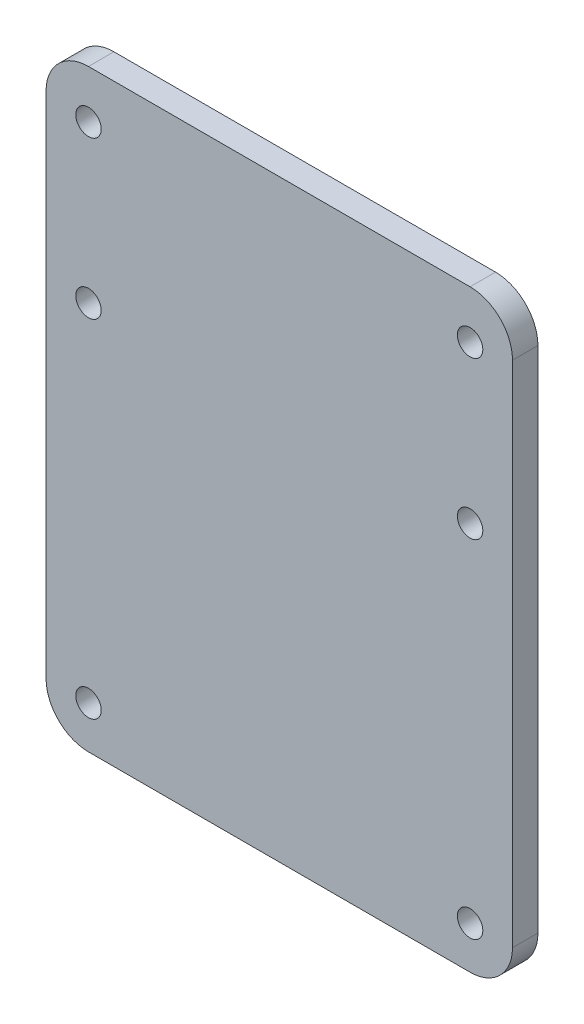
ISO-10303-21;
HEADER;
FILE_DESCRIPTION(('STEP AP214'),'2;1');
FILE_NAME('part.step','',(''),(''),'','','');
FILE_SCHEMA(('AUTOMOTIVE_DESIGN { 1 0 10303 214 1 1 1 1 }'));
ENDSEC;
DATA;
#1=APPLICATION_CONTEXT('core data for automotive mechanical design processes');
#2=APPLICATION_PROTOCOL_DEFINITION('international standard','automotive_design',2000,#1);
#3=PRODUCT_CONTEXT('',#1,'mechanical');
#4=PRODUCT('Part','Part','',(#3));
#5=PRODUCT_RELATED_PRODUCT_CATEGORY('part','',(#4));
#6=PRODUCT_DEFINITION_FORMATION('','',#4);
#7=PRODUCT_DEFINITION_CONTEXT('part definition',#1,'design');
#8=PRODUCT_DEFINITION('design','',#6,#7);
#9=PRODUCT_DEFINITION_SHAPE('','',#8);
#10=(LENGTH_UNIT() NAMED_UNIT(*) SI_UNIT(.MILLI.,.METRE.));
#11=(NAMED_UNIT(*) PLANE_ANGLE_UNIT() SI_UNIT($,.RADIAN.));
#12=(NAMED_UNIT(*) SI_UNIT($,.STERADIAN.) SOLID_ANGLE_UNIT());
#13=UNCERTAINTY_MEASURE_WITH_UNIT(LENGTH_MEASURE(1.E-05),#10,'distance_accuracy_value','');
#14=(GEOMETRIC_REPRESENTATION_CONTEXT(3) GLOBAL_UNCERTAINTY_ASSIGNED_CONTEXT((#13)) GLOBAL_UNIT_ASSIGNED_CONTEXT((#10,
#11,#12)) REPRESENTATION_CONTEXT('',''));
#15=CARTESIAN_POINT('',(0.,0.,0.));
#16=DIRECTION('',(0.,0.,1.));
#17=DIRECTION('',(1.,0.,0.));
#18=AXIS2_PLACEMENT_3D('',#15,#16,#17);
#19=CARTESIAN_POINT('',(-25.7371794871795,42.2489316239316,3.));
#20=DIRECTION('',(1.,0.,0.));
#21=DIRECTION('',(0.,1.,0.));
#22=AXIS2_PLACEMENT_3D('',#19,#20,#21);
#23=PLANE('',#22);
#24=DIRECTION('',(0.,-1.,0.));
#25=VECTOR('',#24,1.);
#26=CARTESIAN_POINT('',(-25.7371794871795,42.2489316239316,0.));
#27=LINE('',#26,#25);
#28=CARTESIAN_POINT('',(-25.7371794871795,37.2489316239316,0.));
#29=VERTEX_POINT('',#28);
#30=CARTESIAN_POINT('',(-25.7371794871795,-22.7510683760684,0.));
#31=VERTEX_POINT('',#30);
#32=EDGE_CURVE('E146',#29,#31,#27,.T.);
#33=ORIENTED_EDGE('',*,*,#32,.T.);
#34=DIRECTION('',(0.,0.,-1.));
#35=VECTOR('',#34,1.);
#36=CARTESIAN_POINT('',(-25.7371794871795,-22.7510683760684,3.));
#37=LINE('',#36,#35);
#38=CARTESIAN_POINT('',(-25.7371794871795,-22.7510683760684,3.));
#39=VERTEX_POINT('',#38);
#40=EDGE_CURVE('E180',#31,#39,#37,.F.);
#41=ORIENTED_EDGE('',*,*,#40,.T.);
#42=DIRECTION('',(0.,-1.,0.));
#43=VECTOR('',#42,1.);
#44=CARTESIAN_POINT('',(-25.7371794871795,42.2489316239316,3.));
#45=LINE('',#44,#43);
#46=CARTESIAN_POINT('',(-25.7371794871795,37.2489316239316,3.));
#47=VERTEX_POINT('',#46);
#48=EDGE_CURVE('E144',#47,#39,#45,.T.);
#49=ORIENTED_EDGE('',*,*,#48,.F.);
#50=DIRECTION('',(0.,0.,-1.));
#51=VECTOR('',#50,1.);
#52=CARTESIAN_POINT('',(-25.7371794871795,37.2489316239316,3.));
#53=LINE('',#52,#51);
#54=EDGE_CURVE('E176',#47,#29,#53,.T.);
#55=ORIENTED_EDGE('',*,*,#54,.T.);
#56=EDGE_LOOP('',(#33,#41,#49,#55));
#57=FACE_BOUND('',#56,.T.);
#58=ADVANCED_FACE('F45',(#57),#23,.F.);
#59=CARTESIAN_POINT('',(-25.7371794871795,-27.7510683760684,3.));
#60=DIRECTION('',(0.,1.,0.));
#61=DIRECTION('',(0.,0.,1.));
#62=AXIS2_PLACEMENT_3D('',#59,#60,#61);
#63=PLANE('',#62);
#64=DIRECTION('',(1.,0.,0.));
#65=VECTOR('',#64,1.);
#66=CARTESIAN_POINT('',(-25.7371794871795,-27.7510683760684,0.));
#67=LINE('',#66,#65);
#68=CARTESIAN_POINT('',(-20.7371794871795,-27.7510683760684,0.));
#69=VERTEX_POINT('',#68);
#70=CARTESIAN_POINT('',(24.2628205128205,-27.7510683760684,0.));
#71=VERTEX_POINT('',#70);
#72=EDGE_CURVE('E140',#69,#71,#67,.T.);
#73=ORIENTED_EDGE('',*,*,#72,.T.);
#74=DIRECTION('',(0.,0.,-1.));
#75=VECTOR('',#74,1.);
#76=CARTESIAN_POINT('',(24.2628205128205,-27.7510683760684,3.));
#77=LINE('',#76,#75);
#78=CARTESIAN_POINT('',(24.2628205128205,-27.7510683760684,3.));
#79=VERTEX_POINT('',#78);
#80=EDGE_CURVE('E116',#71,#79,#77,.F.);
#81=ORIENTED_EDGE('',*,*,#80,.T.);
#82=DIRECTION('',(1.,0.,0.));
#83=VECTOR('',#82,1.);
#84=CARTESIAN_POINT('',(-25.7371794871795,-27.7510683760684,3.));
#85=LINE('',#84,#83);
#86=CARTESIAN_POINT('',(-20.7371794871795,-27.7510683760684,3.));
#87=VERTEX_POINT('',#86);
#88=EDGE_CURVE('E199',#87,#79,#85,.T.);
#89=ORIENTED_EDGE('',*,*,#88,.F.);
#90=DIRECTION('',(0.,0.,-1.));
#91=VECTOR('',#90,1.);
#92=CARTESIAN_POINT('',(-20.7371794871795,-27.7510683760684,3.));
#93=LINE('',#92,#91);
#94=EDGE_CURVE('E122',#87,#69,#93,.T.);
#95=ORIENTED_EDGE('',*,*,#94,.T.);
#96=EDGE_LOOP('',(#73,#81,#89,#95));
#97=FACE_BOUND('',#96,.T.);
#98=ADVANCED_FACE('F272',(#97),#63,.F.);
#99=CARTESIAN_POINT('',(29.2628205128205,42.2489316239316,3.));
#100=DIRECTION('',(-1.,0.,0.));
#101=DIRECTION('',(0.,-1.,0.));
#102=AXIS2_PLACEMENT_3D('',#99,#100,#101);
#103=PLANE('',#102);
#104=DIRECTION('',(0.,1.,0.));
#105=VECTOR('',#104,1.);
#106=CARTESIAN_POINT('',(29.2628205128205,42.2489316239316,3.));
#107=LINE('',#106,#105);
#108=CARTESIAN_POINT('',(29.2628205128205,-22.7510683760684,3.));
#109=VERTEX_POINT('',#108);
#110=CARTESIAN_POINT('',(29.2628205128205,37.2489316239316,3.));
#111=VERTEX_POINT('',#110);
#112=EDGE_CURVE('E131',#109,#111,#107,.T.);
#113=ORIENTED_EDGE('',*,*,#112,.F.);
#114=DIRECTION('',(0.,0.,-1.));
#115=VECTOR('',#114,1.);
#116=CARTESIAN_POINT('',(29.2628205128205,-22.7510683760684,3.));
#117=LINE('',#116,#115);
#118=CARTESIAN_POINT('',(29.2628205128205,-22.7510683760684,0.));
#119=VERTEX_POINT('',#118);
#120=EDGE_CURVE('E115',#109,#119,#117,.T.);
#121=ORIENTED_EDGE('',*,*,#120,.T.);
#122=DIRECTION('',(0.,1.,0.));
#123=VECTOR('',#122,1.);
#124=CARTESIAN_POINT('',(29.2628205128205,42.2489316239316,0.));
#125=LINE('',#124,#123);
#126=CARTESIAN_POINT('',(29.2628205128205,37.2489316239316,0.));
#127=VERTEX_POINT('',#126);
#128=EDGE_CURVE('E129',#119,#127,#125,.T.);
#129=ORIENTED_EDGE('',*,*,#128,.T.);
#130=DIRECTION('',(0.,0.,-1.));
#131=VECTOR('',#130,1.);
#132=CARTESIAN_POINT('',(29.2628205128205,37.2489316239316,3.));
#133=LINE('',#132,#131);
#134=EDGE_CURVE('E134',#127,#111,#133,.F.);
#135=ORIENTED_EDGE('',*,*,#134,.T.);
#136=EDGE_LOOP('',(#113,#121,#129,#135));
#137=FACE_BOUND('',#136,.T.);
#138=ADVANCED_FACE('F128',(#137),#103,.F.);
#139=CARTESIAN_POINT('',(-25.7371794871795,42.2489316239316,3.));
#140=DIRECTION('',(0.,-1.,0.));
#141=DIRECTION('',(0.,0.,-1.));
#142=AXIS2_PLACEMENT_3D('',#139,#140,#141);
#143=PLANE('',#142);
#144=DIRECTION('',(-1.,0.,0.));
#145=VECTOR('',#144,1.);
#146=CARTESIAN_POINT('',(-25.7371794871795,42.2489316239316,0.));
#147=LINE('',#146,#145);
#148=CARTESIAN_POINT('',(24.2628205128205,42.2489316239316,0.));
#149=VERTEX_POINT('',#148);
#150=CARTESIAN_POINT('',(-20.7371794871795,42.2489316239316,0.));
#151=VERTEX_POINT('',#150);
#152=EDGE_CURVE('E139',#149,#151,#147,.T.);
#153=ORIENTED_EDGE('',*,*,#152,.T.);
#154=DIRECTION('',(0.,0.,-1.));
#155=VECTOR('',#154,1.);
#156=CARTESIAN_POINT('',(-20.7371794871795,42.2489316239316,3.));
#157=LINE('',#156,#155);
#158=CARTESIAN_POINT('',(-20.7371794871795,42.2489316239316,3.));
#159=VERTEX_POINT('',#158);
#160=EDGE_CURVE('E11',#151,#159,#157,.F.);
#161=ORIENTED_EDGE('',*,*,#160,.T.);
#162=DIRECTION('',(-1.,0.,0.));
#163=VECTOR('',#162,1.);
#164=CARTESIAN_POINT('',(-25.7371794871795,42.2489316239316,3.));
#165=LINE('',#164,#163);
#166=CARTESIAN_POINT('',(24.2628205128205,42.2489316239316,3.));
#167=VERTEX_POINT('',#166);
#168=EDGE_CURVE('E151',#167,#159,#165,.T.);
#169=ORIENTED_EDGE('',*,*,#168,.F.);
#170=DIRECTION('',(0.,0.,-1.));
#171=VECTOR('',#170,1.);
#172=CARTESIAN_POINT('',(24.2628205128205,42.2489316239316,3.));
#173=LINE('',#172,#171);
#174=EDGE_CURVE('E54',#167,#149,#173,.T.);
#175=ORIENTED_EDGE('',*,*,#174,.T.);
#176=EDGE_LOOP('',(#153,#161,#169,#175));
#177=FACE_BOUND('',#176,.T.);
#178=ADVANCED_FACE('F185',(#177),#143,.F.);
#179=CARTESIAN_POINT('',(0.,0.,3.));
#180=DIRECTION('',(0.,0.,1.));
#181=DIRECTION('',(1.,0.,0.));
#182=AXIS2_PLACEMENT_3D('',#179,#180,#181);
#183=PLANE('',#182);
#184=CARTESIAN_POINT('',(-20.7371794871795,-22.7510683760684,3.));
#185=DIRECTION('',(0.,0.,1.));
#186=DIRECTION('',(1.,0.,0.));
#187=AXIS2_PLACEMENT_3D('',#184,#185,#186);
#188=CIRCLE('',#187,1.5);
#189=CARTESIAN_POINT('',(-19.2371794871795,-22.7510683760684,3.));
#190=VERTEX_POINT('',#189);
#191=EDGE_CURVE('E241',#190,#190,#188,.T.);
#192=ORIENTED_EDGE('',*,*,#191,.F.);
#193=EDGE_LOOP('',(#192));
#194=FACE_BOUND('',#193,.T.);
#195=CARTESIAN_POINT('',(24.2628205128205,18.08796733645,3.));
#196=DIRECTION('',(0.,0.,1.));
#197=DIRECTION('',(1.,0.,0.));
#198=AXIS2_PLACEMENT_3D('',#195,#196,#197);
#199=CIRCLE('',#198,1.5);
#200=CARTESIAN_POINT('',(25.7628205128205,18.08796733645,3.));
#201=VERTEX_POINT('',#200);
#202=EDGE_CURVE('E226',#201,#201,#199,.T.);
#203=ORIENTED_EDGE('',*,*,#202,.F.);
#204=EDGE_LOOP('',(#203));
#205=FACE_BOUND('',#204,.T.);
#206=CARTESIAN_POINT('',(-20.7371794871795,18.08796733645,3.));
#207=DIRECTION('',(0.,0.,1.));
#208=DIRECTION('',(1.,0.,0.));
#209=AXIS2_PLACEMENT_3D('',#206,#207,#208);
#210=CIRCLE('',#209,1.5);
#211=CARTESIAN_POINT('',(-19.2371794871795,18.08796733645,3.));
#212=VERTEX_POINT('',#211);
#213=EDGE_CURVE('E225',#212,#212,#210,.T.);
#214=ORIENTED_EDGE('',*,*,#213,.F.);
#215=EDGE_LOOP('',(#214));
#216=FACE_BOUND('',#215,.T.);
#217=CARTESIAN_POINT('',(24.2628205128205,36.58796733645,3.));
#218=DIRECTION('',(0.,0.,1.));
#219=DIRECTION('',(1.,0.,0.));
#220=AXIS2_PLACEMENT_3D('',#217,#218,#219);
#221=CIRCLE('',#220,1.5);
#222=CARTESIAN_POINT('',(25.7628205128205,36.58796733645,3.));
#223=VERTEX_POINT('',#222);
#224=EDGE_CURVE('E219',#223,#223,#221,.T.);
#225=ORIENTED_EDGE('',*,*,#224,.F.);
#226=EDGE_LOOP('',(#225));
#227=FACE_BOUND('',#226,.T.);
#228=CARTESIAN_POINT('',(24.2628205128205,-22.7510683760684,3.));
#229=DIRECTION('',(0.,0.,1.));
#230=DIRECTION('',(1.,0.,0.));
#231=AXIS2_PLACEMENT_3D('',#228,#229,#230);
#232=CIRCLE('',#231,1.5);
#233=CARTESIAN_POINT('',(25.7628205128205,-22.7510683760684,3.));
#234=VERTEX_POINT('',#233);
#235=EDGE_CURVE('E242',#234,#234,#232,.T.);
#236=ORIENTED_EDGE('',*,*,#235,.F.);
#237=EDGE_LOOP('',(#236));
#238=FACE_BOUND('',#237,.T.);
#239=CARTESIAN_POINT('',(-20.7371794871795,36.58796733645,3.));
#240=DIRECTION('',(0.,0.,1.));
#241=DIRECTION('',(1.,0.,0.));
#242=AXIS2_PLACEMENT_3D('',#239,#240,#241);
#243=CIRCLE('',#242,1.5);
#244=CARTESIAN_POINT('',(-19.2371794871795,36.58796733645,3.));
#245=VERTEX_POINT('',#244);
#246=EDGE_CURVE('E205',#245,#245,#243,.T.);
#247=ORIENTED_EDGE('',*,*,#246,.F.);
#248=EDGE_LOOP('',(#247));
#249=FACE_BOUND('',#248,.T.);
#250=ORIENTED_EDGE('',*,*,#88,.T.);
#251=CARTESIAN_POINT('',(24.2628205128205,-22.7510683760684,3.));
#252=DIRECTION('',(0.,0.,1.));
#253=DIRECTION('',(1.,0.,0.));
#254=AXIS2_PLACEMENT_3D('',#251,#252,#253);
#255=CIRCLE('',#254,5.);
#256=EDGE_CURVE('E173',#79,#109,#255,.T.);
#257=ORIENTED_EDGE('',*,*,#256,.T.);
#258=ORIENTED_EDGE('',*,*,#112,.T.);
#259=CARTESIAN_POINT('',(24.2628205128205,37.2489316239316,3.));
#260=DIRECTION('',(0.,0.,1.));
#261=DIRECTION('',(1.,0.,0.));
#262=AXIS2_PLACEMENT_3D('',#259,#260,#261);
#263=CIRCLE('',#262,5.);
#264=EDGE_CURVE('E66',#111,#167,#263,.T.);
#265=ORIENTED_EDGE('',*,*,#264,.T.);
#266=ORIENTED_EDGE('',*,*,#168,.T.);
#267=CARTESIAN_POINT('',(-20.7371794871795,37.2489316239316,3.));
#268=DIRECTION('',(0.,0.,1.));
#269=DIRECTION('',(1.,0.,0.));
#270=AXIS2_PLACEMENT_3D('',#267,#268,#269);
#271=CIRCLE('',#270,5.);
#272=EDGE_CURVE('E167',#159,#47,#271,.T.);
#273=ORIENTED_EDGE('',*,*,#272,.T.);
#274=ORIENTED_EDGE('',*,*,#48,.T.);
#275=CARTESIAN_POINT('',(-20.7371794871795,-22.7510683760684,3.));
#276=DIRECTION('',(0.,0.,1.));
#277=DIRECTION('',(1.,0.,0.));
#278=AXIS2_PLACEMENT_3D('',#275,#276,#277);
#279=CIRCLE('',#278,5.);
#280=EDGE_CURVE('E170',#39,#87,#279,.T.);
#281=ORIENTED_EDGE('',*,*,#280,.T.);
#282=EDGE_LOOP('',(#250,#257,#258,#265,#266,#273,#274,#281));
#283=FACE_BOUND('',#282,.T.);
#284=ADVANCED_FACE('F263',(#194,#205,#216,#227,#238,#249,#283),#183,.T.);
#285=CARTESIAN_POINT('',(0.,0.,0.));
#286=DIRECTION('',(0.,0.,1.));
#287=DIRECTION('',(1.,0.,0.));
#288=AXIS2_PLACEMENT_3D('',#285,#286,#287);
#289=PLANE('',#288);
#290=CARTESIAN_POINT('',(-20.7371794871795,-22.7510683760684,0.));
#291=DIRECTION('',(0.,0.,1.));
#292=DIRECTION('',(1.,0.,0.));
#293=AXIS2_PLACEMENT_3D('',#290,#291,#292);
#294=CIRCLE('',#293,1.5);
#295=CARTESIAN_POINT('',(-19.2371794871795,-22.7510683760684,0.));
#296=VERTEX_POINT('',#295);
#297=EDGE_CURVE('E237',#296,#296,#294,.T.);
#298=ORIENTED_EDGE('',*,*,#297,.T.);
#299=EDGE_LOOP('',(#298));
#300=FACE_BOUND('',#299,.T.);
#301=CARTESIAN_POINT('',(24.2628205128205,18.08796733645,0.));
#302=DIRECTION('',(0.,0.,1.));
#303=DIRECTION('',(1.,0.,0.));
#304=AXIS2_PLACEMENT_3D('',#301,#302,#303);
#305=CIRCLE('',#304,1.5);
#306=CARTESIAN_POINT('',(25.7628205128205,18.08796733645,0.));
#307=VERTEX_POINT('',#306);
#308=EDGE_CURVE('E246',#307,#307,#305,.T.);
#309=ORIENTED_EDGE('',*,*,#308,.T.);
#310=EDGE_LOOP('',(#309));
#311=FACE_BOUND('',#310,.T.);
#312=CARTESIAN_POINT('',(-20.7371794871795,18.08796733645,0.));
#313=DIRECTION('',(0.,0.,1.));
#314=DIRECTION('',(1.,0.,0.));
#315=AXIS2_PLACEMENT_3D('',#312,#313,#314);
#316=CIRCLE('',#315,1.5);
#317=CARTESIAN_POINT('',(-19.2371794871795,18.08796733645,0.));
#318=VERTEX_POINT('',#317);
#319=EDGE_CURVE('E221',#318,#318,#316,.T.);
#320=ORIENTED_EDGE('',*,*,#319,.T.);
#321=EDGE_LOOP('',(#320));
#322=FACE_BOUND('',#321,.T.);
#323=CARTESIAN_POINT('',(24.2628205128205,36.58796733645,0.));
#324=DIRECTION('',(0.,0.,1.));
#325=DIRECTION('',(1.,0.,0.));
#326=AXIS2_PLACEMENT_3D('',#323,#324,#325);
#327=CIRCLE('',#326,1.5);
#328=CARTESIAN_POINT('',(25.7628205128205,36.58796733645,0.));
#329=VERTEX_POINT('',#328);
#330=EDGE_CURVE('E230',#329,#329,#327,.T.);
#331=ORIENTED_EDGE('',*,*,#330,.T.);
#332=EDGE_LOOP('',(#331));
#333=FACE_BOUND('',#332,.T.);
#334=CARTESIAN_POINT('',(24.2628205128205,-22.7510683760684,0.));
#335=DIRECTION('',(0.,0.,1.));
#336=DIRECTION('',(1.,0.,0.));
#337=AXIS2_PLACEMENT_3D('',#334,#335,#336);
#338=CIRCLE('',#337,1.5);
#339=CARTESIAN_POINT('',(25.7628205128205,-22.7510683760684,0.));
#340=VERTEX_POINT('',#339);
#341=EDGE_CURVE('E253',#340,#340,#338,.T.);
#342=ORIENTED_EDGE('',*,*,#341,.T.);
#343=EDGE_LOOP('',(#342));
#344=FACE_BOUND('',#343,.T.);
#345=CARTESIAN_POINT('',(-20.7371794871795,36.58796733645,0.));
#346=DIRECTION('',(0.,0.,1.));
#347=DIRECTION('',(1.,0.,0.));
#348=AXIS2_PLACEMENT_3D('',#345,#346,#347);
#349=CIRCLE('',#348,1.5);
#350=CARTESIAN_POINT('',(-19.2371794871795,36.58796733645,0.));
#351=VERTEX_POINT('',#350);
#352=EDGE_CURVE('E212',#351,#351,#349,.T.);
#353=ORIENTED_EDGE('',*,*,#352,.T.);
#354=EDGE_LOOP('',(#353));
#355=FACE_BOUND('',#354,.T.);
#356=ORIENTED_EDGE('',*,*,#128,.F.);
#357=CARTESIAN_POINT('',(24.2628205128205,-22.7510683760684,0.));
#358=DIRECTION('',(0.,0.,1.));
#359=DIRECTION('',(1.,0.,0.));
#360=AXIS2_PLACEMENT_3D('',#357,#358,#359);
#361=CIRCLE('',#360,5.);
#362=EDGE_CURVE('E111',#119,#71,#361,.F.);
#363=ORIENTED_EDGE('',*,*,#362,.T.);
#364=ORIENTED_EDGE('',*,*,#72,.F.);
#365=CARTESIAN_POINT('',(-20.7371794871795,-22.7510683760684,0.));
#366=DIRECTION('',(0.,0.,1.));
#367=DIRECTION('',(1.,0.,0.));
#368=AXIS2_PLACEMENT_3D('',#365,#366,#367);
#369=CIRCLE('',#368,5.);
#370=EDGE_CURVE('E123',#69,#31,#369,.F.);
#371=ORIENTED_EDGE('',*,*,#370,.T.);
#372=ORIENTED_EDGE('',*,*,#32,.F.);
#373=CARTESIAN_POINT('',(-20.7371794871795,37.2489316239316,0.));
#374=DIRECTION('',(0.,0.,1.));
#375=DIRECTION('',(1.,0.,0.));
#376=AXIS2_PLACEMENT_3D('',#373,#374,#375);
#377=CIRCLE('',#376,5.);
#378=EDGE_CURVE('E155',#29,#151,#377,.F.);
#379=ORIENTED_EDGE('',*,*,#378,.T.);
#380=ORIENTED_EDGE('',*,*,#152,.F.);
#381=CARTESIAN_POINT('',(24.2628205128205,37.2489316239316,0.));
#382=DIRECTION('',(0.,0.,1.));
#383=DIRECTION('',(1.,0.,0.));
#384=AXIS2_PLACEMENT_3D('',#381,#382,#383);
#385=CIRCLE('',#384,5.);
#386=EDGE_CURVE('E133',#149,#127,#385,.F.);
#387=ORIENTED_EDGE('',*,*,#386,.T.);
#388=EDGE_LOOP('',(#356,#363,#364,#371,#372,#379,#380,#387));
#389=FACE_BOUND('',#388,.T.);
#390=ADVANCED_FACE('F136',(#300,#311,#322,#333,#344,#355,#389),#289,.F.);
#391=CARTESIAN_POINT('',(-20.7371794871795,36.58796733645,0.));
#392=DIRECTION('',(0.,0.,1.));
#393=DIRECTION('',(1.,0.,0.));
#394=AXIS2_PLACEMENT_3D('',#391,#392,#393);
#395=CYLINDRICAL_SURFACE('',#394,1.5);
#396=ORIENTED_EDGE('',*,*,#352,.F.);
#397=EDGE_LOOP('',(#396));
#398=FACE_BOUND('',#397,.T.);
#399=ORIENTED_EDGE('',*,*,#246,.T.);
#400=EDGE_LOOP('',(#399));
#401=FACE_BOUND('',#400,.T.);
#402=ADVANCED_FACE('F296',(#398,#401),#395,.F.);
#403=CARTESIAN_POINT('',(24.2628205128205,-22.7510683760684,0.));
#404=DIRECTION('',(0.,0.,1.));
#405=DIRECTION('',(1.,0.,0.));
#406=AXIS2_PLACEMENT_3D('',#403,#404,#405);
#407=CYLINDRICAL_SURFACE('',#406,1.5);
#408=ORIENTED_EDGE('',*,*,#341,.F.);
#409=EDGE_LOOP('',(#408));
#410=FACE_BOUND('',#409,.T.);
#411=ORIENTED_EDGE('',*,*,#235,.T.);
#412=EDGE_LOOP('',(#411));
#413=FACE_BOUND('',#412,.T.);
#414=ADVANCED_FACE('F261',(#410,#413),#407,.F.);
#415=CARTESIAN_POINT('',(24.2628205128205,36.58796733645,0.));
#416=DIRECTION('',(0.,0.,1.));
#417=DIRECTION('',(1.,0.,0.));
#418=AXIS2_PLACEMENT_3D('',#415,#416,#417);
#419=CYLINDRICAL_SURFACE('',#418,1.5);
#420=ORIENTED_EDGE('',*,*,#330,.F.);
#421=EDGE_LOOP('',(#420));
#422=FACE_BOUND('',#421,.T.);
#423=ORIENTED_EDGE('',*,*,#224,.T.);
#424=EDGE_LOOP('',(#423));
#425=FACE_BOUND('',#424,.T.);
#426=ADVANCED_FACE('F306',(#422,#425),#419,.F.);
#427=CARTESIAN_POINT('',(-20.7371794871795,18.08796733645,0.));
#428=DIRECTION('',(0.,0.,1.));
#429=DIRECTION('',(1.,0.,0.));
#430=AXIS2_PLACEMENT_3D('',#427,#428,#429);
#431=CYLINDRICAL_SURFACE('',#430,1.5);
#432=ORIENTED_EDGE('',*,*,#319,.F.);
#433=EDGE_LOOP('',(#432));
#434=FACE_BOUND('',#433,.T.);
#435=ORIENTED_EDGE('',*,*,#213,.T.);
#436=EDGE_LOOP('',(#435));
#437=FACE_BOUND('',#436,.T.);
#438=ADVANCED_FACE('F302',(#434,#437),#431,.F.);
#439=CARTESIAN_POINT('',(24.2628205128205,18.08796733645,0.));
#440=DIRECTION('',(0.,0.,1.));
#441=DIRECTION('',(1.,0.,0.));
#442=AXIS2_PLACEMENT_3D('',#439,#440,#441);
#443=CYLINDRICAL_SURFACE('',#442,1.5);
#444=ORIENTED_EDGE('',*,*,#308,.F.);
#445=EDGE_LOOP('',(#444));
#446=FACE_BOUND('',#445,.T.);
#447=ORIENTED_EDGE('',*,*,#202,.T.);
#448=EDGE_LOOP('',(#447));
#449=FACE_BOUND('',#448,.T.);
#450=ADVANCED_FACE('F305',(#446,#449),#443,.F.);
#451=CARTESIAN_POINT('',(-20.7371794871795,-22.7510683760684,0.));
#452=DIRECTION('',(0.,0.,1.));
#453=DIRECTION('',(1.,0.,0.));
#454=AXIS2_PLACEMENT_3D('',#451,#452,#453);
#455=CYLINDRICAL_SURFACE('',#454,1.5);
#456=ORIENTED_EDGE('',*,*,#297,.F.);
#457=EDGE_LOOP('',(#456));
#458=FACE_BOUND('',#457,.T.);
#459=ORIENTED_EDGE('',*,*,#191,.T.);
#460=EDGE_LOOP('',(#459));
#461=FACE_BOUND('',#460,.T.);
#462=ADVANCED_FACE('F281',(#458,#461),#455,.F.);
#463=CARTESIAN_POINT('',(24.2628205128205,-22.7510683760684,3.));
#464=DIRECTION('',(0.,0.,-1.));
#465=DIRECTION('',(-1.,0.,0.));
#466=AXIS2_PLACEMENT_3D('',#463,#464,#465);
#467=CYLINDRICAL_SURFACE('',#466,5.);
#468=ORIENTED_EDGE('',*,*,#256,.F.);
#469=ORIENTED_EDGE('',*,*,#80,.F.);
#470=ORIENTED_EDGE('',*,*,#362,.F.);
#471=ORIENTED_EDGE('',*,*,#120,.F.);
#472=EDGE_LOOP('',(#468,#469,#470,#471));
#473=FACE_BOUND('',#472,.T.);
#474=ADVANCED_FACE('F114',(#473),#467,.T.);
#475=CARTESIAN_POINT('',(-20.7371794871795,-22.7510683760684,3.));
#476=DIRECTION('',(0.,0.,-1.));
#477=DIRECTION('',(-1.,0.,0.));
#478=AXIS2_PLACEMENT_3D('',#475,#476,#477);
#479=CYLINDRICAL_SURFACE('',#478,5.);
#480=ORIENTED_EDGE('',*,*,#280,.F.);
#481=ORIENTED_EDGE('',*,*,#40,.F.);
#482=ORIENTED_EDGE('',*,*,#370,.F.);
#483=ORIENTED_EDGE('',*,*,#94,.F.);
#484=EDGE_LOOP('',(#480,#481,#482,#483));
#485=FACE_BOUND('',#484,.T.);
#486=ADVANCED_FACE('F274',(#485),#479,.T.);
#487=CARTESIAN_POINT('',(-20.7371794871795,37.2489316239316,3.));
#488=DIRECTION('',(0.,0.,-1.));
#489=DIRECTION('',(-1.,0.,0.));
#490=AXIS2_PLACEMENT_3D('',#487,#488,#489);
#491=CYLINDRICAL_SURFACE('',#490,5.);
#492=ORIENTED_EDGE('',*,*,#272,.F.);
#493=ORIENTED_EDGE('',*,*,#160,.F.);
#494=ORIENTED_EDGE('',*,*,#378,.F.);
#495=ORIENTED_EDGE('',*,*,#54,.F.);
#496=EDGE_LOOP('',(#492,#493,#494,#495));
#497=FACE_BOUND('',#496,.T.);
#498=ADVANCED_FACE('F192',(#497),#491,.T.);
#499=CARTESIAN_POINT('',(24.2628205128205,37.2489316239316,3.));
#500=DIRECTION('',(0.,0.,-1.));
#501=DIRECTION('',(-1.,0.,0.));
#502=AXIS2_PLACEMENT_3D('',#499,#500,#501);
#503=CYLINDRICAL_SURFACE('',#502,5.);
#504=ORIENTED_EDGE('',*,*,#264,.F.);
#505=ORIENTED_EDGE('',*,*,#134,.F.);
#506=ORIENTED_EDGE('',*,*,#386,.F.);
#507=ORIENTED_EDGE('',*,*,#174,.F.);
#508=EDGE_LOOP('',(#504,#505,#506,#507));
#509=FACE_BOUND('',#508,.T.);
#510=ADVANCED_FACE('F47',(#509),#503,.T.);
#511=CLOSED_SHELL('',(#58,#98,#138,#178,#284,#390,#402,#414,#426,#438,#450,#462,#474,#486,#498,#510));
#512=MANIFOLD_SOLID_BREP('B2',#511);
#513=ADVANCED_BREP_SHAPE_REPRESENTATION('',(#18,#512),#14);
#514=SHAPE_DEFINITION_REPRESENTATION(#9,#513);
ENDSEC;
END-ISO-10303-21;
